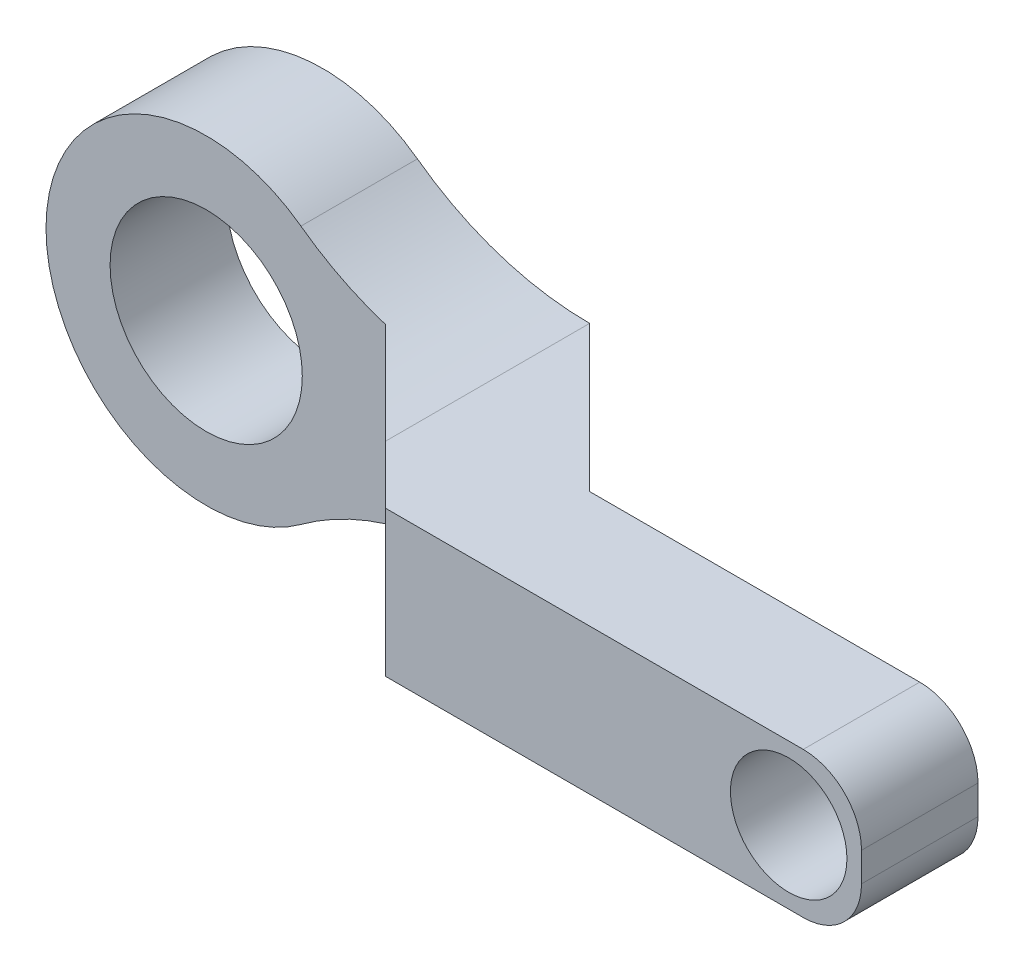
ISO-10303-21;
HEADER;
FILE_DESCRIPTION(('STEP AP214'),'2;1');
FILE_NAME('part.step','',(''),(''),'','','');
FILE_SCHEMA(('AUTOMOTIVE_DESIGN { 1 0 10303 214 1 1 1 1 }'));
ENDSEC;
DATA;
#1=APPLICATION_CONTEXT('core data for automotive mechanical design processes');
#2=APPLICATION_PROTOCOL_DEFINITION('international standard','automotive_design',2000,#1);
#3=PRODUCT_CONTEXT('',#1,'mechanical');
#4=PRODUCT('Part','Part','',(#3));
#5=PRODUCT_RELATED_PRODUCT_CATEGORY('part','',(#4));
#6=PRODUCT_DEFINITION_FORMATION('','',#4);
#7=PRODUCT_DEFINITION_CONTEXT('part definition',#1,'design');
#8=PRODUCT_DEFINITION('design','',#6,#7);
#9=PRODUCT_DEFINITION_SHAPE('','',#8);
#10=(LENGTH_UNIT() NAMED_UNIT(*) SI_UNIT(.MILLI.,.METRE.));
#11=(NAMED_UNIT(*) PLANE_ANGLE_UNIT() SI_UNIT($,.RADIAN.));
#12=(NAMED_UNIT(*) SI_UNIT($,.STERADIAN.) SOLID_ANGLE_UNIT());
#13=UNCERTAINTY_MEASURE_WITH_UNIT(LENGTH_MEASURE(1.E-05),#10,'distance_accuracy_value','');
#14=(GEOMETRIC_REPRESENTATION_CONTEXT(3) GLOBAL_UNCERTAINTY_ASSIGNED_CONTEXT((#13)) GLOBAL_UNIT_ASSIGNED_CONTEXT((#10,
#11,#12)) REPRESENTATION_CONTEXT('',''));
#15=CARTESIAN_POINT('',(0.,0.,0.));
#16=DIRECTION('',(0.,0.,1.));
#17=DIRECTION('',(1.,0.,0.));
#18=AXIS2_PLACEMENT_3D('',#15,#16,#17);
#19=CARTESIAN_POINT('',(0.,0.,0.));
#20=DIRECTION('',(0.,0.,1.));
#21=DIRECTION('',(1.,0.,0.));
#22=AXIS2_PLACEMENT_3D('',#19,#20,#21);
#23=PLANE('',#22);
#24=CARTESIAN_POINT('',(0.,0.,0.));
#25=DIRECTION('',(0.,0.,1.));
#26=DIRECTION('',(1.,0.,0.));
#27=AXIS2_PLACEMENT_3D('',#24,#25,#26);
#28=CIRCLE('',#27,2.);
#29=CARTESIAN_POINT('',(2.,0.,0.));
#30=VERTEX_POINT('',#29);
#31=EDGE_CURVE('E184',#30,#30,#28,.T.);
#32=ORIENTED_EDGE('',*,*,#31,.T.);
#33=EDGE_LOOP('',(#32));
#34=FACE_BOUND('',#33,.T.);
#35=DIRECTION('',(-1.,0.,0.));
#36=VECTOR('',#35,1.);
#37=CARTESIAN_POINT('',(0.,-2.5,0.));
#38=LINE('',#37,#36);
#39=CARTESIAN_POINT('',(0.5,-2.5,0.));
#40=VERTEX_POINT('',#39);
#41=CARTESIAN_POINT('',(-10.8348486100883,-2.5,0.));
#42=VERTEX_POINT('',#41);
#43=EDGE_CURVE('E179',#40,#42,#38,.T.);
#44=ORIENTED_EDGE('',*,*,#43,.T.);
#45=DIRECTION('',(0.,1.,0.));
#46=VECTOR('',#45,1.);
#47=CARTESIAN_POINT('',(-10.8348486100883,2.50000000000003,0.));
#48=LINE('',#47,#46);
#49=CARTESIAN_POINT('',(-10.8348486100883,2.5,0.));
#50=VERTEX_POINT('',#49);
#51=EDGE_CURVE('E247',#42,#50,#48,.T.);
#52=ORIENTED_EDGE('',*,*,#51,.T.);
#53=DIRECTION('',(-1.,0.,0.));
#54=VECTOR('',#53,1.);
#55=CARTESIAN_POINT('',(0.,2.5,0.));
#56=LINE('',#55,#54);
#57=CARTESIAN_POINT('',(0.499999999999999,2.5,0.));
#58=VERTEX_POINT('',#57);
#59=EDGE_CURVE('E203',#58,#50,#56,.T.);
#60=ORIENTED_EDGE('',*,*,#59,.F.);
#61=CARTESIAN_POINT('',(0.499999999999999,0.500000000000004,0.));
#62=DIRECTION('',(0.,0.,1.));
#63=DIRECTION('',(1.,0.,0.));
#64=AXIS2_PLACEMENT_3D('',#61,#62,#63);
#65=CIRCLE('',#64,2.);
#66=CARTESIAN_POINT('',(2.5,0.500000000000005,0.));
#67=VERTEX_POINT('',#66);
#68=EDGE_CURVE('E228',#58,#67,#65,.F.);
#69=ORIENTED_EDGE('',*,*,#68,.T.);
#70=DIRECTION('',(0.,1.,0.));
#71=VECTOR('',#70,1.);
#72=CARTESIAN_POINT('',(2.5,0.,0.));
#73=LINE('',#72,#71);
#74=CARTESIAN_POINT('',(2.5,-0.5,0.));
#75=VERTEX_POINT('',#74);
#76=EDGE_CURVE('E199',#75,#67,#73,.T.);
#77=ORIENTED_EDGE('',*,*,#76,.F.);
#78=CARTESIAN_POINT('',(0.5,-0.5,0.));
#79=DIRECTION('',(0.,0.,1.));
#80=DIRECTION('',(1.,0.,0.));
#81=AXIS2_PLACEMENT_3D('',#78,#79,#80);
#82=CIRCLE('',#81,2.);
#83=EDGE_CURVE('E225',#75,#40,#82,.F.);
#84=ORIENTED_EDGE('',*,*,#83,.T.);
#85=EDGE_LOOP('',(#44,#52,#60,#69,#77,#84));
#86=FACE_BOUND('',#85,.T.);
#87=ADVANCED_FACE('F48',(#34,#86),#23,.F.);
#88=CARTESIAN_POINT('',(-25.,0.,4.));
#89=DIRECTION('',(0.,0.,-1.));
#90=DIRECTION('',(-1.,0.,0.));
#91=AXIS2_PLACEMENT_3D('',#88,#89,#90);
#92=CYLINDRICAL_SURFACE('',#91,5.5);
#93=DIRECTION('',(0.,0.,-1.));
#94=VECTOR('',#93,1.);
#95=CARTESIAN_POINT('',(-21.7478495068055,-4.43548387096774,4.));
#96=LINE('',#95,#94);
#97=CARTESIAN_POINT('',(-21.7478495068055,-4.43548387096774,-5.));
#98=VERTEX_POINT('',#97);
#99=CARTESIAN_POINT('',(-21.7478495068055,-4.43548387096774,-1.));
#100=VERTEX_POINT('',#99);
#101=EDGE_CURVE('E195',#98,#100,#96,.F.);
#102=ORIENTED_EDGE('',*,*,#101,.T.);
#103=CARTESIAN_POINT('',(-25.,0.,-1.));
#104=DIRECTION('',(0.,0.,1.));
#105=DIRECTION('',(-1.,0.,0.));
#106=AXIS2_PLACEMENT_3D('',#103,#104,#105);
#107=CIRCLE('',#106,5.5);
#108=CARTESIAN_POINT('',(-21.7478495068055,4.43548387096774,-1.));
#109=VERTEX_POINT('',#108);
#110=EDGE_CURVE('E147',#109,#100,#107,.T.);
#111=ORIENTED_EDGE('',*,*,#110,.F.);
#112=DIRECTION('',(0.,0.,-1.));
#113=VECTOR('',#112,1.);
#114=CARTESIAN_POINT('',(-21.7478495068055,4.43548387096774,4.));
#115=LINE('',#114,#113);
#116=CARTESIAN_POINT('',(-21.7478495068055,4.43548387096774,-5.));
#117=VERTEX_POINT('',#116);
#118=EDGE_CURVE('E212',#109,#117,#115,.T.);
#119=ORIENTED_EDGE('',*,*,#118,.T.);
#120=CARTESIAN_POINT('',(-25.,0.,-5.));
#121=DIRECTION('',(0.,0.,-1.));
#122=DIRECTION('',(1.,0.,0.));
#123=AXIS2_PLACEMENT_3D('',#120,#121,#122);
#124=CIRCLE('',#123,5.5);
#125=EDGE_CURVE('E163',#98,#117,#124,.T.);
#126=ORIENTED_EDGE('',*,*,#125,.F.);
#127=EDGE_LOOP('',(#102,#111,#119,#126));
#128=FACE_BOUND('',#127,.T.);
#129=ADVANCED_FACE('F291',(#128),#92,.T.);
#130=CARTESIAN_POINT('',(0.,-2.5,4.));
#131=DIRECTION('',(0.,-1.,0.));
#132=DIRECTION('',(1.,0.,0.));
#133=AXIS2_PLACEMENT_3D('',#130,#131,#132);
#134=PLANE('',#133);
#135=DIRECTION('',(-1.,0.,0.));
#136=VECTOR('',#135,1.);
#137=CARTESIAN_POINT('',(0.,-2.5,4.));
#138=LINE('',#137,#136);
#139=CARTESIAN_POINT('',(0.5,-2.5,4.));
#140=VERTEX_POINT('',#139);
#141=CARTESIAN_POINT('',(-13.8348486100883,-2.5,4.));
#142=VERTEX_POINT('',#141);
#143=EDGE_CURVE('E180',#140,#142,#138,.T.);
#144=ORIENTED_EDGE('',*,*,#143,.T.);
#145=DIRECTION('',(-0.707106781186549,0.,-0.707106781186546));
#146=VECTOR('',#145,1.);
#147=CARTESIAN_POINT('',(-6.91742430504413,-2.5,10.9174243050442));
#148=LINE('',#147,#146);
#149=CARTESIAN_POINT('',(-15.8348486100883,-2.5,1.99999999999999));
#150=VERTEX_POINT('',#149);
#151=EDGE_CURVE('E58',#142,#150,#148,.T.);
#152=ORIENTED_EDGE('',*,*,#151,.T.);
#153=DIRECTION('',(0.,0.,-1.));
#154=VECTOR('',#153,1.);
#155=CARTESIAN_POINT('',(-15.8348486100883,-2.5,4.));
#156=LINE('',#155,#154);
#157=CARTESIAN_POINT('',(-15.8348486100883,-2.5,-5.));
#158=VERTEX_POINT('',#157);
#159=EDGE_CURVE('E138',#150,#158,#156,.T.);
#160=ORIENTED_EDGE('',*,*,#159,.T.);
#161=DIRECTION('',(-0.707106781186546,0.,-0.707106781186549));
#162=VECTOR('',#161,1.);
#163=CARTESIAN_POINT('',(-15.8348486100883,-2.5,-5.00000000000002));
#164=LINE('',#163,#162);
#165=EDGE_CURVE('E250',#158,#42,#164,.F.);
#166=ORIENTED_EDGE('',*,*,#165,.T.);
#167=ORIENTED_EDGE('',*,*,#43,.F.);
#168=DIRECTION('',(0.,0.,-1.));
#169=VECTOR('',#168,1.);
#170=CARTESIAN_POINT('',(0.5,-2.5,4.));
#171=LINE('',#170,#169);
#172=EDGE_CURVE('E244',#40,#140,#171,.F.);
#173=ORIENTED_EDGE('',*,*,#172,.T.);
#174=EDGE_LOOP('',(#144,#152,#160,#166,#167,#173));
#175=FACE_BOUND('',#174,.T.);
#176=ADVANCED_FACE('F314',(#175),#134,.T.);
#177=CARTESIAN_POINT('',(2.5,0.,4.));
#178=DIRECTION('',(-1.,0.,0.));
#179=DIRECTION('',(0.,-1.,0.));
#180=AXIS2_PLACEMENT_3D('',#177,#178,#179);
#181=PLANE('',#180);
#182=ORIENTED_EDGE('',*,*,#76,.T.);
#183=DIRECTION('',(0.,0.,-1.));
#184=VECTOR('',#183,1.);
#185=CARTESIAN_POINT('',(2.5,0.500000000000005,4.));
#186=LINE('',#185,#184);
#187=CARTESIAN_POINT('',(2.5,0.500000000000005,4.));
#188=VERTEX_POINT('',#187);
#189=EDGE_CURVE('E235',#67,#188,#186,.F.);
#190=ORIENTED_EDGE('',*,*,#189,.T.);
#191=DIRECTION('',(0.,1.,0.));
#192=VECTOR('',#191,1.);
#193=CARTESIAN_POINT('',(2.5,0.,4.));
#194=LINE('',#193,#192);
#195=CARTESIAN_POINT('',(2.5,-0.5,4.));
#196=VERTEX_POINT('',#195);
#197=EDGE_CURVE('E183',#196,#188,#194,.T.);
#198=ORIENTED_EDGE('',*,*,#197,.F.);
#199=DIRECTION('',(0.,0.,-1.));
#200=VECTOR('',#199,1.);
#201=CARTESIAN_POINT('',(2.5,-0.5,0.));
#202=LINE('',#201,#200);
#203=EDGE_CURVE('E231',#196,#75,#202,.T.);
#204=ORIENTED_EDGE('',*,*,#203,.T.);
#205=EDGE_LOOP('',(#182,#190,#198,#204));
#206=FACE_BOUND('',#205,.T.);
#207=ADVANCED_FACE('F324',(#206),#181,.F.);
#208=CARTESIAN_POINT('',(0.,2.5,4.));
#209=DIRECTION('',(0.,-1.,0.));
#210=DIRECTION('',(1.,0.,0.));
#211=AXIS2_PLACEMENT_3D('',#208,#209,#210);
#212=PLANE('',#211);
#213=DIRECTION('',(0.,0.,1.));
#214=VECTOR('',#213,1.);
#215=CARTESIAN_POINT('',(-15.8348486100883,2.5,4.));
#216=LINE('',#215,#214);
#217=CARTESIAN_POINT('',(-15.8348486100883,2.5,-5.));
#218=VERTEX_POINT('',#217);
#219=CARTESIAN_POINT('',(-15.8348486100883,2.5,1.99999999999999));
#220=VERTEX_POINT('',#219);
#221=EDGE_CURVE('E215',#218,#220,#216,.T.);
#222=ORIENTED_EDGE('',*,*,#221,.T.);
#223=DIRECTION('',(0.707106781186549,0.,0.707106781186546));
#224=VECTOR('',#223,1.);
#225=CARTESIAN_POINT('',(-18.8348486100883,2.5,-1.));
#226=LINE('',#225,#224);
#227=CARTESIAN_POINT('',(-13.8348486100883,2.5,4.));
#228=VERTEX_POINT('',#227);
#229=EDGE_CURVE('E259',#220,#228,#226,.T.);
#230=ORIENTED_EDGE('',*,*,#229,.T.);
#231=DIRECTION('',(-1.,0.,0.));
#232=VECTOR('',#231,1.);
#233=CARTESIAN_POINT('',(0.,2.5,4.));
#234=LINE('',#233,#232);
#235=CARTESIAN_POINT('',(0.499999999999999,2.5,4.));
#236=VERTEX_POINT('',#235);
#237=EDGE_CURVE('E188',#236,#228,#234,.T.);
#238=ORIENTED_EDGE('',*,*,#237,.F.);
#239=DIRECTION('',(0.,0.,-1.));
#240=VECTOR('',#239,1.);
#241=CARTESIAN_POINT('',(0.499999999999999,2.5,4.));
#242=LINE('',#241,#240);
#243=EDGE_CURVE('E221',#236,#58,#242,.T.);
#244=ORIENTED_EDGE('',*,*,#243,.T.);
#245=ORIENTED_EDGE('',*,*,#59,.T.);
#246=DIRECTION('',(0.707106781186546,0.,0.707106781186549));
#247=VECTOR('',#246,1.);
#248=CARTESIAN_POINT('',(-3.41742430504419,2.5,7.41742430504418));
#249=LINE('',#248,#247);
#250=EDGE_CURVE('E253',#50,#218,#249,.F.);
#251=ORIENTED_EDGE('',*,*,#250,.T.);
#252=EDGE_LOOP('',(#222,#230,#238,#244,#245,#251));
#253=FACE_BOUND('',#252,.T.);
#254=ADVANCED_FACE('F266',(#253),#212,.F.);
#255=CARTESIAN_POINT('',(-25.,0.,4.));
#256=DIRECTION('',(0.,0.,-1.));
#257=DIRECTION('',(-1.,0.,0.));
#258=AXIS2_PLACEMENT_3D('',#255,#256,#257);
#259=CYLINDRICAL_SURFACE('',#258,3.3);
#260=CARTESIAN_POINT('',(-25.,0.,-1.));
#261=DIRECTION('',(0.,0.,1.));
#262=DIRECTION('',(1.,0.,0.));
#263=AXIS2_PLACEMENT_3D('',#260,#261,#262);
#264=CIRCLE('',#263,3.3);
#265=CARTESIAN_POINT('',(-21.7,0.,-1.));
#266=VERTEX_POINT('',#265);
#267=EDGE_CURVE('E335',#266,#266,#264,.T.);
#268=ORIENTED_EDGE('',*,*,#267,.T.);
#269=EDGE_LOOP('',(#268));
#270=FACE_BOUND('',#269,.T.);
#271=CARTESIAN_POINT('',(-25.,0.,-5.));
#272=DIRECTION('',(0.,0.,-1.));
#273=DIRECTION('',(-1.,0.,0.));
#274=AXIS2_PLACEMENT_3D('',#271,#272,#273);
#275=CIRCLE('',#274,3.3);
#276=CARTESIAN_POINT('',(-28.3,0.,-5.));
#277=VERTEX_POINT('',#276);
#278=EDGE_CURVE('E156',#277,#277,#275,.T.);
#279=ORIENTED_EDGE('',*,*,#278,.T.);
#280=EDGE_LOOP('',(#279));
#281=FACE_BOUND('',#280,.T.);
#282=ADVANCED_FACE('F320',(#270,#281),#259,.F.);
#283=CARTESIAN_POINT('',(0.,0.,4.));
#284=DIRECTION('',(0.,0.,-1.));
#285=DIRECTION('',(-1.,0.,0.));
#286=AXIS2_PLACEMENT_3D('',#283,#284,#285);
#287=CYLINDRICAL_SURFACE('',#286,2.);
#288=CARTESIAN_POINT('',(0.,0.,4.));
#289=DIRECTION('',(0.,0.,1.));
#290=DIRECTION('',(1.,0.,0.));
#291=AXIS2_PLACEMENT_3D('',#288,#289,#290);
#292=CIRCLE('',#291,2.);
#293=CARTESIAN_POINT('',(2.,0.,4.));
#294=VERTEX_POINT('',#293);
#295=EDGE_CURVE('E191',#294,#294,#292,.T.);
#296=ORIENTED_EDGE('',*,*,#295,.T.);
#297=EDGE_LOOP('',(#296));
#298=FACE_BOUND('',#297,.T.);
#299=ORIENTED_EDGE('',*,*,#31,.F.);
#300=EDGE_LOOP('',(#299));
#301=FACE_BOUND('',#300,.T.);
#302=ADVANCED_FACE('F303',(#298,#301),#287,.F.);
#303=CARTESIAN_POINT('',(0.,0.,4.));
#304=DIRECTION('',(0.,0.,1.));
#305=DIRECTION('',(1.,0.,0.));
#306=AXIS2_PLACEMENT_3D('',#303,#304,#305);
#307=PLANE('',#306);
#308=ORIENTED_EDGE('',*,*,#237,.T.);
#309=DIRECTION('',(0.,-1.,0.));
#310=VECTOR('',#309,1.);
#311=CARTESIAN_POINT('',(-13.8348486100883,-2.96060798583055,4.));
#312=LINE('',#311,#310);
#313=EDGE_CURVE('E72',#228,#142,#312,.T.);
#314=ORIENTED_EDGE('',*,*,#313,.T.);
#315=ORIENTED_EDGE('',*,*,#143,.F.);
#316=CARTESIAN_POINT('',(0.5,-0.5,4.));
#317=DIRECTION('',(0.,0.,1.));
#318=DIRECTION('',(1.,0.,0.));
#319=AXIS2_PLACEMENT_3D('',#316,#317,#318);
#320=CIRCLE('',#319,2.);
#321=EDGE_CURVE('E238',#140,#196,#320,.T.);
#322=ORIENTED_EDGE('',*,*,#321,.T.);
#323=ORIENTED_EDGE('',*,*,#197,.T.);
#324=CARTESIAN_POINT('',(0.499999999999999,0.500000000000004,4.));
#325=DIRECTION('',(0.,0.,1.));
#326=DIRECTION('',(1.,0.,0.));
#327=AXIS2_PLACEMENT_3D('',#324,#325,#326);
#328=CIRCLE('',#327,2.);
#329=EDGE_CURVE('E241',#188,#236,#328,.T.);
#330=ORIENTED_EDGE('',*,*,#329,.T.);
#331=EDGE_LOOP('',(#308,#314,#315,#322,#323,#330));
#332=FACE_BOUND('',#331,.T.);
#333=ORIENTED_EDGE('',*,*,#295,.F.);
#334=EDGE_LOOP('',(#333));
#335=FACE_BOUND('',#334,.T.);
#336=ADVANCED_FACE('F268',(#332,#335),#307,.T.);
#337=CARTESIAN_POINT('',(-15.8348486100883,12.5,4.));
#338=DIRECTION('',(0.,0.,-1.));
#339=DIRECTION('',(-1.,0.,0.));
#340=AXIS2_PLACEMENT_3D('',#337,#338,#339);
#341=CYLINDRICAL_SURFACE('',#340,10.);
#342=CARTESIAN_POINT('',(-15.8348486100883,12.5,-1.));
#343=DIRECTION('',(0.,0.,-1.));
#344=DIRECTION('',(1.,0.,0.));
#345=AXIS2_PLACEMENT_3D('',#342,#343,#344);
#346=CIRCLE('',#345,10.);
#347=CARTESIAN_POINT('',(-18.8348486100883,2.96060798583054,-1.));
#348=VERTEX_POINT('',#347);
#349=EDGE_CURVE('E153',#348,#109,#346,.T.);
#350=ORIENTED_EDGE('',*,*,#349,.F.);
#351=CARTESIAN_POINT('',(-15.8348486100883,12.5,1.99999999999998));
#352=DIRECTION('',(-0.707106781186546,0.,0.707106781186549));
#353=DIRECTION('',(-0.707106781186549,0.,-0.707106781186546));
#354=AXIS2_PLACEMENT_3D('',#351,#352,#353);
#355=ELLIPSE('',#354,14.1421356237309,10.);
#356=EDGE_CURVE('E151',#348,#220,#355,.T.);
#357=ORIENTED_EDGE('',*,*,#356,.T.);
#358=ORIENTED_EDGE('',*,*,#221,.F.);
#359=CARTESIAN_POINT('',(-15.8348486100883,12.5,-5.));
#360=DIRECTION('',(0.,0.,1.));
#361=DIRECTION('',(1.,0.,0.));
#362=AXIS2_PLACEMENT_3D('',#359,#360,#361);
#363=CIRCLE('',#362,10.);
#364=EDGE_CURVE('E167',#117,#218,#363,.T.);
#365=ORIENTED_EDGE('',*,*,#364,.F.);
#366=ORIENTED_EDGE('',*,*,#118,.F.);
#367=EDGE_LOOP('',(#350,#357,#358,#365,#366));
#368=FACE_BOUND('',#367,.T.);
#369=ADVANCED_FACE('F294',(#368),#341,.F.);
#370=CARTESIAN_POINT('',(-15.8348486100883,-12.5,4.));
#371=DIRECTION('',(0.,0.,-1.));
#372=DIRECTION('',(-1.,0.,0.));
#373=AXIS2_PLACEMENT_3D('',#370,#371,#372);
#374=CYLINDRICAL_SURFACE('',#373,10.);
#375=ORIENTED_EDGE('',*,*,#159,.F.);
#376=CARTESIAN_POINT('',(-15.8348486100883,-12.5,2.));
#377=DIRECTION('',(-0.707106781186546,0.,0.707106781186549));
#378=DIRECTION('',(-0.707106781186549,0.,-0.707106781186546));
#379=AXIS2_PLACEMENT_3D('',#376,#377,#378);
#380=ELLIPSE('',#379,14.1421356237309,10.);
#381=CARTESIAN_POINT('',(-18.8348486100883,-2.96060798583055,-1.));
#382=VERTEX_POINT('',#381);
#383=EDGE_CURVE('E12',#150,#382,#380,.T.);
#384=ORIENTED_EDGE('',*,*,#383,.T.);
#385=CARTESIAN_POINT('',(-15.8348486100883,-12.5,-1.));
#386=DIRECTION('',(0.,0.,-1.));
#387=DIRECTION('',(-1.,0.,0.));
#388=AXIS2_PLACEMENT_3D('',#385,#386,#387);
#389=CIRCLE('',#388,10.);
#390=EDGE_CURVE('E135',#100,#382,#389,.T.);
#391=ORIENTED_EDGE('',*,*,#390,.F.);
#392=ORIENTED_EDGE('',*,*,#101,.F.);
#393=CARTESIAN_POINT('',(-15.8348486100883,-12.5,-5.));
#394=DIRECTION('',(0.,0.,1.));
#395=DIRECTION('',(-1.,0.,0.));
#396=AXIS2_PLACEMENT_3D('',#393,#394,#395);
#397=CIRCLE('',#396,10.);
#398=EDGE_CURVE('E175',#158,#98,#397,.T.);
#399=ORIENTED_EDGE('',*,*,#398,.F.);
#400=EDGE_LOOP('',(#375,#384,#391,#392,#399));
#401=FACE_BOUND('',#400,.T.);
#402=ADVANCED_FACE('F134',(#401),#374,.F.);
#403=CARTESIAN_POINT('',(0.499999999999999,0.500000000000004,4.));
#404=DIRECTION('',(0.,0.,-1.));
#405=DIRECTION('',(-1.,0.,0.));
#406=AXIS2_PLACEMENT_3D('',#403,#404,#405);
#407=CYLINDRICAL_SURFACE('',#406,2.);
#408=ORIENTED_EDGE('',*,*,#329,.F.);
#409=ORIENTED_EDGE('',*,*,#189,.F.);
#410=ORIENTED_EDGE('',*,*,#68,.F.);
#411=ORIENTED_EDGE('',*,*,#243,.F.);
#412=EDGE_LOOP('',(#408,#409,#410,#411));
#413=FACE_BOUND('',#412,.T.);
#414=ADVANCED_FACE('F274',(#413),#407,.T.);
#415=CARTESIAN_POINT('',(0.5,-0.5,4.));
#416=DIRECTION('',(0.,0.,1.));
#417=DIRECTION('',(1.,0.,0.));
#418=AXIS2_PLACEMENT_3D('',#415,#416,#417);
#419=CYLINDRICAL_SURFACE('',#418,2.);
#420=ORIENTED_EDGE('',*,*,#321,.F.);
#421=ORIENTED_EDGE('',*,*,#172,.F.);
#422=ORIENTED_EDGE('',*,*,#83,.F.);
#423=ORIENTED_EDGE('',*,*,#203,.F.);
#424=EDGE_LOOP('',(#420,#421,#422,#423));
#425=FACE_BOUND('',#424,.T.);
#426=ADVANCED_FACE('F338',(#425),#419,.T.);
#427=CARTESIAN_POINT('',(-25.,0.,-5.));
#428=DIRECTION('',(0.,0.,1.));
#429=DIRECTION('',(1.,0.,0.));
#430=AXIS2_PLACEMENT_3D('',#427,#428,#429);
#431=PLANE('',#430);
#432=ORIENTED_EDGE('',*,*,#125,.T.);
#433=ORIENTED_EDGE('',*,*,#364,.T.);
#434=DIRECTION('',(0.,-1.,0.));
#435=VECTOR('',#434,1.);
#436=CARTESIAN_POINT('',(-15.8348486100883,2.5,-5.));
#437=LINE('',#436,#435);
#438=EDGE_CURVE('E171',#218,#158,#437,.T.);
#439=ORIENTED_EDGE('',*,*,#438,.T.);
#440=ORIENTED_EDGE('',*,*,#398,.T.);
#441=EDGE_LOOP('',(#432,#433,#439,#440));
#442=FACE_BOUND('',#441,.T.);
#443=ORIENTED_EDGE('',*,*,#278,.F.);
#444=EDGE_LOOP('',(#443));
#445=FACE_BOUND('',#444,.T.);
#446=ADVANCED_FACE('F286',(#442,#445),#431,.F.);
#447=CARTESIAN_POINT('',(-15.8348486100883,2.5,-5.));
#448=DIRECTION('',(0.707106781186549,0.,-0.707106781186546));
#449=DIRECTION('',(0.,1.,0.));
#450=AXIS2_PLACEMENT_3D('',#447,#448,#449);
#451=PLANE('',#450);
#452=ORIENTED_EDGE('',*,*,#250,.F.);
#453=ORIENTED_EDGE('',*,*,#51,.F.);
#454=ORIENTED_EDGE('',*,*,#165,.F.);
#455=ORIENTED_EDGE('',*,*,#438,.F.);
#456=EDGE_LOOP('',(#452,#453,#454,#455));
#457=FACE_BOUND('',#456,.T.);
#458=ADVANCED_FACE('F283',(#457),#451,.T.);
#459=CARTESIAN_POINT('',(-25.,0.,-1.));
#460=DIRECTION('',(0.,0.,-1.));
#461=DIRECTION('',(-1.,0.,0.));
#462=AXIS2_PLACEMENT_3D('',#459,#460,#461);
#463=PLANE('',#462);
#464=ORIENTED_EDGE('',*,*,#267,.F.);
#465=EDGE_LOOP('',(#464));
#466=FACE_BOUND('',#465,.T.);
#467=ORIENTED_EDGE('',*,*,#110,.T.);
#468=ORIENTED_EDGE('',*,*,#390,.T.);
#469=DIRECTION('',(0.,1.,0.));
#470=VECTOR('',#469,1.);
#471=CARTESIAN_POINT('',(-18.8348486100883,-2.96060798583055,-1.));
#472=LINE('',#471,#470);
#473=EDGE_CURVE('E144',#382,#348,#472,.T.);
#474=ORIENTED_EDGE('',*,*,#473,.T.);
#475=ORIENTED_EDGE('',*,*,#349,.T.);
#476=EDGE_LOOP('',(#467,#468,#474,#475));
#477=FACE_BOUND('',#476,.T.);
#478=ADVANCED_FACE('F143',(#466,#477),#463,.F.);
#479=CARTESIAN_POINT('',(-18.8348486100883,-2.96060798583055,-1.));
#480=DIRECTION('',(-0.707106781186546,0.,0.707106781186549));
#481=DIRECTION('',(0.,-1.,0.));
#482=AXIS2_PLACEMENT_3D('',#479,#480,#481);
#483=PLANE('',#482);
#484=ORIENTED_EDGE('',*,*,#151,.F.);
#485=ORIENTED_EDGE('',*,*,#313,.F.);
#486=ORIENTED_EDGE('',*,*,#229,.F.);
#487=ORIENTED_EDGE('',*,*,#356,.F.);
#488=ORIENTED_EDGE('',*,*,#473,.F.);
#489=ORIENTED_EDGE('',*,*,#383,.F.);
#490=EDGE_LOOP('',(#484,#485,#486,#487,#488,#489));
#491=FACE_BOUND('',#490,.T.);
#492=ADVANCED_FACE('F51',(#491),#483,.T.);
#493=CLOSED_SHELL('',(#87,#129,#176,#207,#254,#282,#302,#336,#369,#402,#414,#426,#446,#458,#478,#492));
#494=MANIFOLD_SOLID_BREP('B2',#493);
#495=ADVANCED_BREP_SHAPE_REPRESENTATION('',(#18,#494),#14);
#496=SHAPE_DEFINITION_REPRESENTATION(#9,#495);
ENDSEC;
END-ISO-10303-21;
